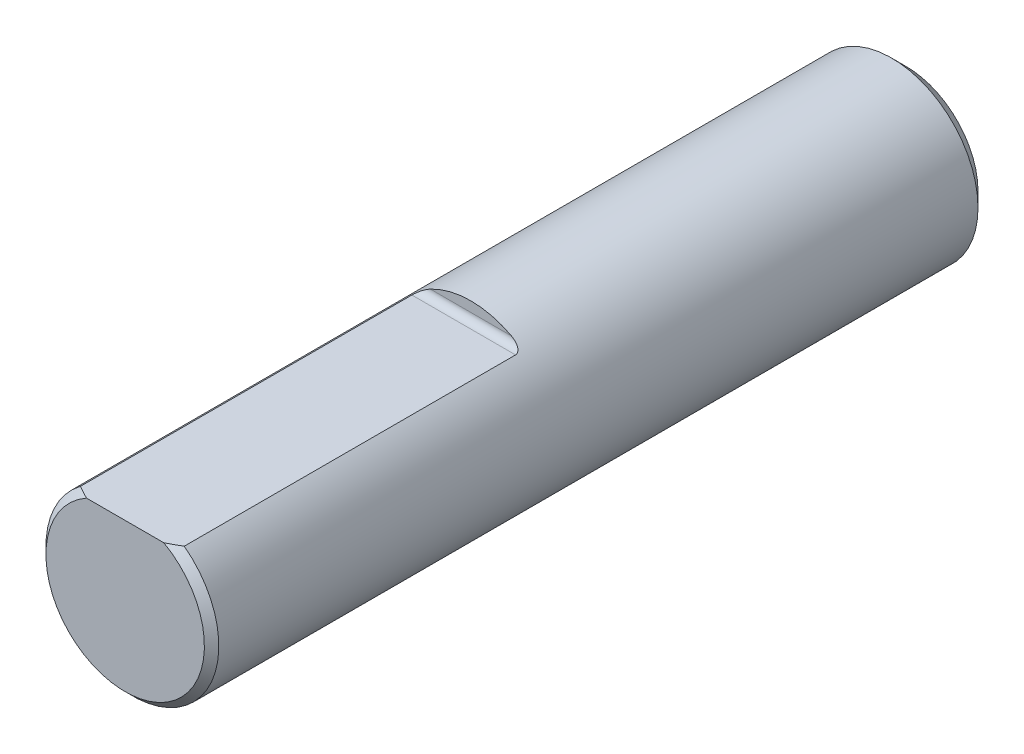
ISO-10303-21;
HEADER;
FILE_DESCRIPTION(('STEP AP214'),'2;1');
FILE_NAME('part.step','',(''),(''),'','','');
FILE_SCHEMA(('AUTOMOTIVE_DESIGN { 1 0 10303 214 1 1 1 1 }'));
ENDSEC;
DATA;
#1=APPLICATION_CONTEXT('core data for automotive mechanical design processes');
#2=APPLICATION_PROTOCOL_DEFINITION('international standard','automotive_design',2000,#1);
#3=PRODUCT_CONTEXT('',#1,'mechanical');
#4=PRODUCT('Part','Part','',(#3));
#5=PRODUCT_RELATED_PRODUCT_CATEGORY('part','',(#4));
#6=PRODUCT_DEFINITION_FORMATION('','',#4);
#7=PRODUCT_DEFINITION_CONTEXT('part definition',#1,'design');
#8=PRODUCT_DEFINITION('design','',#6,#7);
#9=PRODUCT_DEFINITION_SHAPE('','',#8);
#10=(LENGTH_UNIT() NAMED_UNIT(*) SI_UNIT(.MILLI.,.METRE.));
#11=(NAMED_UNIT(*) PLANE_ANGLE_UNIT() SI_UNIT($,.RADIAN.));
#12=(NAMED_UNIT(*) SI_UNIT($,.STERADIAN.) SOLID_ANGLE_UNIT());
#13=UNCERTAINTY_MEASURE_WITH_UNIT(LENGTH_MEASURE(1.E-05),#10,'distance_accuracy_value','');
#14=(GEOMETRIC_REPRESENTATION_CONTEXT(3) GLOBAL_UNCERTAINTY_ASSIGNED_CONTEXT((#13)) GLOBAL_UNIT_ASSIGNED_CONTEXT((#10,
#11,#12)) REPRESENTATION_CONTEXT('',''));
#15=CARTESIAN_POINT('',(0.,0.,0.));
#16=DIRECTION('',(0.,0.,1.));
#17=DIRECTION('',(1.,0.,0.));
#18=AXIS2_PLACEMENT_3D('',#15,#16,#17);
#19=CARTESIAN_POINT('',(0.,0.,27.1));
#20=DIRECTION('',(0.,0.,-1.));
#21=DIRECTION('',(-1.,0.,0.));
#22=AXIS2_PLACEMENT_3D('',#19,#20,#21);
#23=CYLINDRICAL_SURFACE('',#22,3.);
#24=CARTESIAN_POINT('',(0.,0.,0.500000000000021));
#25=DIRECTION('',(0.,0.,1.));
#26=DIRECTION('',(1.,0.,0.));
#27=AXIS2_PLACEMENT_3D('',#24,#25,#26);
#28=CIRCLE('',#27,3.);
#29=CARTESIAN_POINT('',(3.,0.,0.500000000000021));
#30=VERTEX_POINT('',#29);
#31=EDGE_CURVE('E186',#30,#30,#28,.T.);
#32=ORIENTED_EDGE('',*,*,#31,.T.);
#33=EDGE_LOOP('',(#32));
#34=FACE_BOUND('',#33,.T.);
#35=CARTESIAN_POINT('',(0.,0.,15.1));
#36=DIRECTION('',(0.,0.,1.));
#37=DIRECTION('',(1.,0.,0.));
#38=AXIS2_PLACEMENT_3D('',#35,#36,#37);
#39=CIRCLE('',#38,3.);
#40=CARTESIAN_POINT('',(1.40623611104252,2.65,15.1));
#41=VERTEX_POINT('',#40);
#42=CARTESIAN_POINT('',(-1.40623611104252,2.65,15.1));
#43=VERTEX_POINT('',#42);
#44=EDGE_CURVE('E127',#41,#43,#39,.T.);
#45=ORIENTED_EDGE('',*,*,#44,.F.);
#46=CARTESIAN_POINT('',(1.40623611104252,2.65,15.1));
#47=CARTESIAN_POINT('',(1.42476719312358,2.64016820918073,15.1000086371319));
#48=CARTESIAN_POINT('',(1.44320541755287,2.63013300387646,15.1005812001906));
#49=CARTESIAN_POINT('',(1.47987326357008,2.609677203619,15.1030548188532));
#50=CARTESIAN_POINT('',(1.49810172472944,2.59925520129951,15.1049612940171));
#51=CARTESIAN_POINT('',(1.5343315751367,2.57803639991808,15.110329872664));
#52=CARTESIAN_POINT('',(1.55232959190176,2.567237122853,15.1138054139997));
#53=CARTESIAN_POINT('',(1.587744792987,2.54548552392082,15.1225921781681));
#54=CARTESIAN_POINT('',(1.60516300800453,2.53453352883204,15.1278999291877));
#55=CARTESIAN_POINT('',(1.63485119249192,2.51545006459067,15.1390846196437));
#56=CARTESIAN_POINT('',(1.64730062464286,2.50731204810866,15.1444706479159));
#57=CARTESIAN_POINT('',(1.67158745821928,2.49118591569291,15.1566602982219));
#58=CARTESIAN_POINT('',(1.68342527260069,2.48319770099929,15.1634629477389));
#59=CARTESIAN_POINT('',(1.7063536380022,2.46749911358801,15.178783929621));
#60=CARTESIAN_POINT('',(1.71743676342143,2.45979177514725,15.1873167211089));
#61=CARTESIAN_POINT('',(1.73834080545491,2.44506310531191,15.2063169358666));
#62=CARTESIAN_POINT('',(1.74816416885122,2.43804045064985,15.2167805095582));
#63=CARTESIAN_POINT('',(1.76296100156874,2.4273488297489,15.2359681663318));
#64=CARTESIAN_POINT('',(1.76845651552901,2.42334468487254,15.2440999651992));
#65=CARTESIAN_POINT('',(1.77837742284304,2.41607356683765,15.2613121283322));
#66=CARTESIAN_POINT('',(1.78280270247776,2.412806672019,15.2703925932529));
#67=CARTESIAN_POINT('',(1.79033772979604,2.40722107270283,15.2895122670731));
#68=CARTESIAN_POINT('',(1.79343027877899,2.40491477660354,15.2995620738033));
#69=CARTESIAN_POINT('',(1.79791719542313,2.40156245011977,15.3202177234302));
#70=CARTESIAN_POINT('',(1.79931806471234,2.40051159487049,15.3308212730418));
#71=CARTESIAN_POINT('',(1.79993609107004,2.40004787789945,15.3443119358684));
#72=CARTESIAN_POINT('',(1.80000125917157,2.39999896367675,15.3471567213289));
#73=CARTESIAN_POINT('',(1.8,2.4,15.35));
#74=B_SPLINE_CURVE_WITH_KNOTS('',3,(#46,#47,#48,#49,#50,#51,#52,#53,#54,#55,#56,#57,#58,#59,#60,
#61,#62,#63,#64,#65,#66,#67,#68,#69,#70,#71,#72,#73),.UNSPECIFIED.,.F.,.F.,(4,2,2,2,2,2,2,2,2,2,
2,2,2,4),(0.,0.0629448752516046,0.126146985991397,0.189900955592974,0.253534776403439,
0.300929708760606,0.348292210920324,0.396068177672549,0.443749898608375,0.475451559889888,
0.507156588191373,0.539259331957677,0.571238298604583,0.579771352693865),.UNSPECIFIED.);
#75=CARTESIAN_POINT('',(1.8,2.4,15.35));
#76=VERTEX_POINT('',#75);
#77=EDGE_CURVE('E59',#41,#76,#74,.T.);
#78=ORIENTED_EDGE('',*,*,#77,.T.);
#79=DIRECTION('',(0.,0.,1.));
#80=VECTOR('',#79,1.);
#81=CARTESIAN_POINT('',(1.8,2.4,15.1));
#82=LINE('',#81,#80);
#83=CARTESIAN_POINT('',(1.8,2.4,26.85));
#84=VERTEX_POINT('',#83);
#85=EDGE_CURVE('E133',#76,#84,#82,.T.);
#86=ORIENTED_EDGE('',*,*,#85,.T.);
#87=CARTESIAN_POINT('',(0.,0.,26.85));
#88=DIRECTION('',(0.,0.,1.));
#89=DIRECTION('',(1.,0.,0.));
#90=AXIS2_PLACEMENT_3D('',#87,#88,#89);
#91=CIRCLE('',#90,3.);
#92=CARTESIAN_POINT('',(-1.8,2.4,26.85));
#93=VERTEX_POINT('',#92);
#94=EDGE_CURVE('E188',#84,#93,#91,.F.);
#95=ORIENTED_EDGE('',*,*,#94,.T.);
#96=DIRECTION('',(0.,0.,1.));
#97=VECTOR('',#96,1.);
#98=CARTESIAN_POINT('',(-1.8,2.4,15.1));
#99=LINE('',#98,#97);
#100=CARTESIAN_POINT('',(-1.8,2.4,15.35));
#101=VERTEX_POINT('',#100);
#102=EDGE_CURVE('E130',#101,#93,#99,.T.);
#103=ORIENTED_EDGE('',*,*,#102,.F.);
#104=CARTESIAN_POINT('',(-1.8,2.4,15.35));
#105=CARTESIAN_POINT('',(-1.80002307596757,2.3999805782066,15.3398497762364));
#106=CARTESIAN_POINT('',(-1.79917762268597,2.40061688617292,15.3297358056779));
#107=CARTESIAN_POINT('',(-1.79595829572651,2.40302732127865,15.3100064136077));
#108=CARTESIAN_POINT('',(-1.79360165849544,2.4047886160273,15.3003866749197));
#109=CARTESIAN_POINT('',(-1.7875726833598,2.40927311413033,15.2818678747454));
#110=CARTESIAN_POINT('',(-1.78390570997181,2.41199239485877,15.272966053617));
#111=CARTESIAN_POINT('',(-1.77549784658827,2.41818838106542,15.255949471908));
#112=CARTESIAN_POINT('',(-1.77075379680029,2.42166731394476,15.2478371295));
#113=CARTESIAN_POINT('',(-1.75783211284051,2.43107324956358,15.2286061898585));
#114=CARTESIAN_POINT('',(-1.74912509698599,2.43735345452888,15.2180179864987));
#115=CARTESIAN_POINT('',(-1.73041079319432,2.45067580006142,15.1986445717313));
#116=CARTESIAN_POINT('',(-1.720401237775,2.45771926566297,15.1898625750475));
#117=CARTESIAN_POINT('',(-1.69291719447429,2.47678356115711,15.1688774643669));
#118=CARTESIAN_POINT('',(-1.67469673683116,2.48915658953795,15.157981015766));
#119=CARTESIAN_POINT('',(-1.63679129355607,2.51424696062243,15.139488799886));
#120=CARTESIAN_POINT('',(-1.61709867274992,2.52696584431851,15.1319118722863));
#121=CARTESIAN_POINT('',(-1.58162893424236,2.54927028707975,15.1209400595368));
#122=CARTESIAN_POINT('',(-1.56603616538931,2.55888071698269,15.1169789548098));
#123=CARTESIAN_POINT('',(-1.53445756909974,2.57794112174126,15.1103976350237));
#124=CARTESIAN_POINT('',(-1.51847138971993,2.58739093911798,15.107778669992));
#125=CARTESIAN_POINT('',(-1.48653771156903,2.60586627018725,15.1037481910994));
#126=CARTESIAN_POINT('',(-1.47059570505126,2.61489647961756,15.1023138133363));
#127=CARTESIAN_POINT('',(-1.4385387009133,2.63266838458361,15.1004432278105));
#128=CARTESIAN_POINT('',(-1.42242416370951,2.64141067387946,15.1000048201049));
#129=CARTESIAN_POINT('',(-1.40623611104252,2.65,15.1));
#130=B_SPLINE_CURVE_WITH_KNOTS('',3,(#104,#105,#106,#107,#108,#109,#110,#111,#112,#113,#114,
#115,#116,#117,#118,#119,#120,#121,#122,#123,#124,#125,#126,#127,#128,#129),.UNSPECIFIED.,.F.,
.F.,(4,2,2,2,2,2,2,2,2,2,2,2,4),(0.,0.0303382083179854,0.0603363917658789,0.0902131438331527,
0.120178703859017,0.165158889955237,0.210218452837776,0.283525899859539,0.357244171671546,
0.413407103500159,0.469622249114082,0.524725195147192,0.579706308511011),.UNSPECIFIED.);
#131=EDGE_CURVE('E11',#101,#43,#130,.T.);
#132=ORIENTED_EDGE('',*,*,#131,.T.);
#133=EDGE_LOOP('',(#45,#78,#86,#95,#103,#132));
#134=FACE_BOUND('',#133,.T.);
#135=ADVANCED_FACE('F45',(#34,#134),#23,.T.);
#136=CARTESIAN_POINT('',(0.,0.,27.1));
#137=DIRECTION('',(0.,0.,1.));
#138=DIRECTION('',(1.,0.,0.));
#139=AXIS2_PLACEMENT_3D('',#136,#137,#138);
#140=PLANE('',#139);
#141=DIRECTION('',(1.,0.,0.));
#142=VECTOR('',#141,1.);
#143=CARTESIAN_POINT('',(-1.8,2.4,27.1));
#144=LINE('',#143,#142);
#145=CARTESIAN_POINT('',(-1.34257215820978,2.4,27.1));
#146=VERTEX_POINT('',#145);
#147=CARTESIAN_POINT('',(1.34257215820978,2.4,27.1));
#148=VERTEX_POINT('',#147);
#149=EDGE_CURVE('E125',#146,#148,#144,.T.);
#150=ORIENTED_EDGE('',*,*,#149,.F.);
#151=CARTESIAN_POINT('',(0.,0.,27.1));
#152=DIRECTION('',(0.,0.,1.));
#153=DIRECTION('',(1.,0.,0.));
#154=AXIS2_PLACEMENT_3D('',#151,#152,#153);
#155=CIRCLE('',#154,2.75000000000001);
#156=EDGE_CURVE('E135',#146,#148,#155,.T.);
#157=ORIENTED_EDGE('',*,*,#156,.T.);
#158=EDGE_LOOP('',(#150,#157));
#159=FACE_BOUND('',#158,.T.);
#160=ADVANCED_FACE('F163',(#159),#140,.T.);
#161=CARTESIAN_POINT('',(0.,0.,0.));
#162=DIRECTION('',(0.,0.,1.));
#163=DIRECTION('',(1.,0.,0.));
#164=AXIS2_PLACEMENT_3D('',#161,#162,#163);
#165=PLANE('',#164);
#166=CARTESIAN_POINT('',(0.,0.,0.));
#167=DIRECTION('',(0.,0.,1.));
#168=DIRECTION('',(1.,0.,0.));
#169=AXIS2_PLACEMENT_3D('',#166,#167,#168);
#170=CIRCLE('',#169,2.49999999999998);
#171=CARTESIAN_POINT('',(2.49999999999998,0.,0.));
#172=VERTEX_POINT('',#171);
#173=EDGE_CURVE('E183',#172,#172,#170,.F.);
#174=ORIENTED_EDGE('',*,*,#173,.T.);
#175=EDGE_LOOP('',(#174));
#176=FACE_BOUND('',#175,.T.);
#177=DIRECTION('',(1.,0.,0.));
#178=VECTOR('',#177,1.);
#179=CARTESIAN_POINT('',(0.,0.75,0.));
#180=LINE('',#179,#178);
#181=CARTESIAN_POINT('',(-0.661437827766148,0.75,0.));
#182=VERTEX_POINT('',#181);
#183=CARTESIAN_POINT('',(0.661437827766148,0.75,0.));
#184=VERTEX_POINT('',#183);
#185=EDGE_CURVE('E120',#182,#184,#180,.T.);
#186=ORIENTED_EDGE('',*,*,#185,.F.);
#187=CARTESIAN_POINT('',(0.,0.,0.));
#188=DIRECTION('',(0.,0.,-1.));
#189=DIRECTION('',(-1.,0.,0.));
#190=AXIS2_PLACEMENT_3D('',#187,#188,#189);
#191=CIRCLE('',#190,1.);
#192=EDGE_CURVE('E108',#184,#182,#191,.T.);
#193=ORIENTED_EDGE('',*,*,#192,.F.);
#194=EDGE_LOOP('',(#186,#193));
#195=FACE_BOUND('',#194,.T.);
#196=ADVANCED_FACE('F161',(#176,#195),#165,.F.);
#197=CARTESIAN_POINT('',(-1.8,2.4,15.1));
#198=DIRECTION('',(0.,-1.,0.));
#199=DIRECTION('',(0.,0.,-1.));
#200=AXIS2_PLACEMENT_3D('',#197,#198,#199);
#201=PLANE('',#200);
#202=ORIENTED_EDGE('',*,*,#85,.F.);
#203=DIRECTION('',(1.,0.,0.));
#204=VECTOR('',#203,1.);
#205=CARTESIAN_POINT('',(-1.8,2.4,15.35));
#206=LINE('',#205,#204);
#207=EDGE_CURVE('E66',#76,#101,#206,.F.);
#208=ORIENTED_EDGE('',*,*,#207,.T.);
#209=ORIENTED_EDGE('',*,*,#102,.T.);
#210=CARTESIAN_POINT('',(-1.8,2.4,26.85));
#211=CARTESIAN_POINT('',(-1.76273123698928,2.4,26.8723595436047));
#212=CARTESIAN_POINT('',(-1.72526649526937,2.4,26.8943956211421));
#213=CARTESIAN_POINT('',(-1.64993454455618,2.4,26.9377272457753));
#214=CARTESIAN_POINT('',(-1.6120675295446,2.4,26.9590231303671));
#215=CARTESIAN_POINT('',(-1.53588371404093,2.4,27.0008029147796));
#216=CARTESIAN_POINT('',(-1.49756688517465,2.4,27.0212867630167));
#217=CARTESIAN_POINT('',(-1.42044115771704,2.4,27.0613498939592));
#218=CARTESIAN_POINT('',(-1.38163203974269,2.4,27.0809287539275));
#219=CARTESIAN_POINT('',(-1.34257215820978,2.4,27.1));
#220=B_SPLINE_CURVE_WITH_KNOTS('',3,(#210,#211,#212,#213,#214,#215,#216,#217,#218,#219),
.UNSPECIFIED.,.F.,.F.,(4,2,2,2,4),(0.,0.130385484602137,0.260710717625486,0.391044216193948,
0.521437993147202),.UNSPECIFIED.);
#221=EDGE_CURVE('E139',#93,#146,#220,.T.);
#222=ORIENTED_EDGE('',*,*,#221,.T.);
#223=ORIENTED_EDGE('',*,*,#149,.T.);
#224=CARTESIAN_POINT('',(1.34257215820978,2.4,27.1));
#225=CARTESIAN_POINT('',(1.38163203974269,2.4,27.0809287539275));
#226=CARTESIAN_POINT('',(1.42044115771705,2.4,27.0613498939592));
#227=CARTESIAN_POINT('',(1.49756688517465,2.4,27.0212867630167));
#228=CARTESIAN_POINT('',(1.53588371404093,2.4,27.0008029147796));
#229=CARTESIAN_POINT('',(1.6120675295446,2.4,26.9590231303671));
#230=CARTESIAN_POINT('',(1.64993454455618,2.4,26.9377272457753));
#231=CARTESIAN_POINT('',(1.72526649526937,2.4,26.8943956211421));
#232=CARTESIAN_POINT('',(1.76273123698928,2.4,26.8723595436047));
#233=CARTESIAN_POINT('',(1.8,2.4,26.85));
#234=B_SPLINE_CURVE_WITH_KNOTS('',3,(#224,#225,#226,#227,#228,#229,#230,#231,#232,#233),
.UNSPECIFIED.,.F.,.F.,(4,2,2,2,4),(0.,0.130393776953253,0.260727275521715,0.391052508545065,
0.521437993147201),.UNSPECIFIED.);
#235=EDGE_CURVE('E147',#148,#84,#234,.T.);
#236=ORIENTED_EDGE('',*,*,#235,.T.);
#237=EDGE_LOOP('',(#202,#208,#209,#222,#223,#236));
#238=FACE_BOUND('',#237,.T.);
#239=ADVANCED_FACE('F155',(#238),#201,.F.);
#240=CARTESIAN_POINT('',(0.,0.,15.1));
#241=DIRECTION('',(0.,0.,1.));
#242=DIRECTION('',(1.,0.,0.));
#243=AXIS2_PLACEMENT_3D('',#240,#241,#242);
#244=PLANE('',#243);
#245=ORIENTED_EDGE('',*,*,#44,.T.);
#246=DIRECTION('',(1.,0.,0.));
#247=VECTOR('',#246,1.);
#248=CARTESIAN_POINT('',(0.,2.65,15.1));
#249=LINE('',#248,#247);
#250=EDGE_CURVE('E180',#43,#41,#249,.T.);
#251=ORIENTED_EDGE('',*,*,#250,.T.);
#252=EDGE_LOOP('',(#245,#251));
#253=FACE_BOUND('',#252,.T.);
#254=ADVANCED_FACE('F160',(#253),#244,.T.);
#255=CARTESIAN_POINT('',(0.,0.,27.1));
#256=DIRECTION('',(0.,0.,-1.));
#257=DIRECTION('',(-1.,0.,0.));
#258=AXIS2_PLACEMENT_3D('',#255,#256,#257);
#259=CONICAL_SURFACE('',#258,2.75000000000001,0.785398163397451);
#260=ORIENTED_EDGE('',*,*,#221,.F.);
#261=ORIENTED_EDGE('',*,*,#94,.F.);
#262=ORIENTED_EDGE('',*,*,#235,.F.);
#263=ORIENTED_EDGE('',*,*,#156,.F.);
#264=EDGE_LOOP('',(#260,#261,#262,#263));
#265=FACE_BOUND('',#264,.T.);
#266=ADVANCED_FACE('F153',(#265),#259,.T.);
#267=CARTESIAN_POINT('',(0.,0.,2.5));
#268=DIRECTION('',(0.,0.,-1.));
#269=DIRECTION('',(-1.,0.,0.));
#270=AXIS2_PLACEMENT_3D('',#267,#268,#269);
#271=CYLINDRICAL_SURFACE('',#270,1.);
#272=ORIENTED_EDGE('',*,*,#192,.T.);
#273=DIRECTION('',(0.,0.,-1.));
#274=VECTOR('',#273,1.);
#275=CARTESIAN_POINT('',(-0.661437827766148,0.75,2.5));
#276=LINE('',#275,#274);
#277=CARTESIAN_POINT('',(-0.661437827766148,0.75,2.5));
#278=VERTEX_POINT('',#277);
#279=EDGE_CURVE('E102',#278,#182,#276,.T.);
#280=ORIENTED_EDGE('',*,*,#279,.F.);
#281=CARTESIAN_POINT('',(0.,0.,2.5));
#282=DIRECTION('',(0.,0.,-1.));
#283=DIRECTION('',(-1.,0.,0.));
#284=AXIS2_PLACEMENT_3D('',#281,#282,#283);
#285=CIRCLE('',#284,1.);
#286=CARTESIAN_POINT('',(0.661437827766148,0.75,2.5));
#287=VERTEX_POINT('',#286);
#288=EDGE_CURVE('E106',#287,#278,#285,.T.);
#289=ORIENTED_EDGE('',*,*,#288,.F.);
#290=DIRECTION('',(0.,0.,-1.));
#291=VECTOR('',#290,1.);
#292=CARTESIAN_POINT('',(0.661437827766148,0.75,2.5));
#293=LINE('',#292,#291);
#294=EDGE_CURVE('E112',#287,#184,#293,.T.);
#295=ORIENTED_EDGE('',*,*,#294,.T.);
#296=EDGE_LOOP('',(#272,#280,#289,#295));
#297=FACE_BOUND('',#296,.T.);
#298=ADVANCED_FACE('F104',(#297),#271,.F.);
#299=CARTESIAN_POINT('',(0.,0.75,2.5));
#300=DIRECTION('',(0.,1.,0.));
#301=DIRECTION('',(0.,0.,1.));
#302=AXIS2_PLACEMENT_3D('',#299,#300,#301);
#303=PLANE('',#302);
#304=ORIENTED_EDGE('',*,*,#185,.T.);
#305=ORIENTED_EDGE('',*,*,#294,.F.);
#306=DIRECTION('',(1.,0.,0.));
#307=VECTOR('',#306,1.);
#308=CARTESIAN_POINT('',(0.,0.75,2.5));
#309=LINE('',#308,#307);
#310=EDGE_CURVE('E113',#278,#287,#309,.T.);
#311=ORIENTED_EDGE('',*,*,#310,.F.);
#312=ORIENTED_EDGE('',*,*,#279,.T.);
#313=EDGE_LOOP('',(#304,#305,#311,#312));
#314=FACE_BOUND('',#313,.T.);
#315=ADVANCED_FACE('F116',(#314),#303,.F.);
#316=CARTESIAN_POINT('',(0.,0.,2.5));
#317=DIRECTION('',(0.,0.,-1.));
#318=DIRECTION('',(-1.,0.,0.));
#319=AXIS2_PLACEMENT_3D('',#316,#317,#318);
#320=PLANE('',#319);
#321=ORIENTED_EDGE('',*,*,#288,.T.);
#322=ORIENTED_EDGE('',*,*,#310,.T.);
#323=EDGE_LOOP('',(#321,#322));
#324=FACE_BOUND('',#323,.T.);
#325=ADVANCED_FACE('F119',(#324),#320,.T.);
#326=CARTESIAN_POINT('',(0.,0.,0.500000000000021));
#327=DIRECTION('',(0.,0.,1.));
#328=DIRECTION('',(1.,0.,0.));
#329=AXIS2_PLACEMENT_3D('',#326,#327,#328);
#330=CONICAL_SURFACE('',#329,3.,0.785398163397449);
#331=ORIENTED_EDGE('',*,*,#173,.F.);
#332=EDGE_LOOP('',(#331));
#333=FACE_BOUND('',#332,.T.);
#334=ORIENTED_EDGE('',*,*,#31,.F.);
#335=EDGE_LOOP('',(#334));
#336=FACE_BOUND('',#335,.T.);
#337=ADVANCED_FACE('F214',(#333,#336),#330,.T.);
#338=CARTESIAN_POINT('',(0.,2.65,15.35));
#339=DIRECTION('',(1.,0.,0.));
#340=DIRECTION('',(0.,0.,-1.));
#341=AXIS2_PLACEMENT_3D('',#338,#339,#340);
#342=CYLINDRICAL_SURFACE('',#341,0.25);
#343=ORIENTED_EDGE('',*,*,#131,.F.);
#344=ORIENTED_EDGE('',*,*,#207,.F.);
#345=ORIENTED_EDGE('',*,*,#77,.F.);
#346=ORIENTED_EDGE('',*,*,#250,.F.);
#347=EDGE_LOOP('',(#343,#344,#345,#346));
#348=FACE_BOUND('',#347,.T.);
#349=ADVANCED_FACE('F47',(#348),#342,.F.);
#350=CLOSED_SHELL('',(#135,#160,#196,#239,#254,#266,#298,#315,#325,#337,#349));
#351=MANIFOLD_SOLID_BREP('B2',#350);
#352=ADVANCED_BREP_SHAPE_REPRESENTATION('',(#18,#351),#14);
#353=SHAPE_DEFINITION_REPRESENTATION(#9,#352);
ENDSEC;
END-ISO-10303-21;
